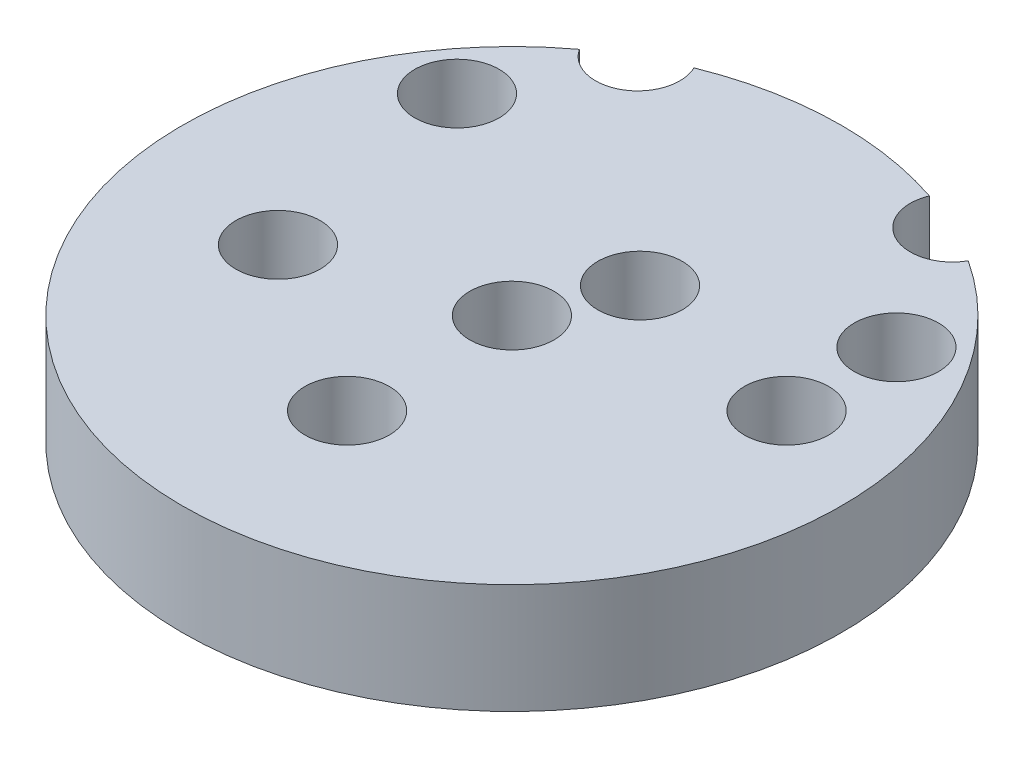
ISO-10303-21;
HEADER;
FILE_DESCRIPTION(('STEP AP214'),'2;1');
FILE_NAME('part.step','',(''),(''),'','','');
FILE_SCHEMA(('AUTOMOTIVE_DESIGN { 1 0 10303 214 1 1 1 1 }'));
ENDSEC;
DATA;
#1=APPLICATION_CONTEXT('core data for automotive mechanical design processes');
#2=APPLICATION_PROTOCOL_DEFINITION('international standard','automotive_design',2000,#1);
#3=PRODUCT_CONTEXT('',#1,'mechanical');
#4=PRODUCT('Part','Part','',(#3));
#5=PRODUCT_RELATED_PRODUCT_CATEGORY('part','',(#4));
#6=PRODUCT_DEFINITION_FORMATION('','',#4);
#7=PRODUCT_DEFINITION_CONTEXT('part definition',#1,'design');
#8=PRODUCT_DEFINITION('design','',#6,#7);
#9=PRODUCT_DEFINITION_SHAPE('','',#8);
#10=(LENGTH_UNIT() NAMED_UNIT(*) SI_UNIT(.MILLI.,.METRE.));
#11=(NAMED_UNIT(*) PLANE_ANGLE_UNIT() SI_UNIT($,.RADIAN.));
#12=(NAMED_UNIT(*) SI_UNIT($,.STERADIAN.) SOLID_ANGLE_UNIT());
#13=UNCERTAINTY_MEASURE_WITH_UNIT(LENGTH_MEASURE(1.E-05),#10,'distance_accuracy_value','');
#14=(GEOMETRIC_REPRESENTATION_CONTEXT(3) GLOBAL_UNCERTAINTY_ASSIGNED_CONTEXT((#13)) GLOBAL_UNIT_ASSIGNED_CONTEXT((#10,
#11,#12)) REPRESENTATION_CONTEXT('',''));
#15=CARTESIAN_POINT('',(0.,0.,0.));
#16=DIRECTION('',(0.,0.,1.));
#17=DIRECTION('',(1.,0.,0.));
#18=AXIS2_PLACEMENT_3D('',#15,#16,#17);
#19=CARTESIAN_POINT('',(0.,-25.4,0.));
#20=DIRECTION('',(0.,1.,0.));
#21=DIRECTION('',(0.,0.,1.));
#22=AXIS2_PLACEMENT_3D('',#19,#20,#21);
#23=CYLINDRICAL_SURFACE('',#22,76.2);
#24=DIRECTION('',(0.,1.,0.));
#25=VECTOR('',#24,1.);
#26=CARTESIAN_POINT('',(-45.5135836289187,-12.7,-61.1142676079279));
#27=LINE('',#26,#25);
#28=CARTESIAN_POINT('',(-45.5135836289187,-25.4,-61.1142676079279));
#29=VERTEX_POINT('',#28);
#30=CARTESIAN_POINT('',(-45.5135836289187,0.,-61.1142676079279));
#31=VERTEX_POINT('',#30);
#32=EDGE_CURVE('E11',#29,#31,#27,.T.);
#33=ORIENTED_EDGE('',*,*,#32,.F.);
#34=CARTESIAN_POINT('',(0.,-25.4,0.));
#35=DIRECTION('',(0.,1.,0.));
#36=DIRECTION('',(0.,0.,1.));
#37=AXIS2_PLACEMENT_3D('',#34,#35,#36);
#38=CIRCLE('',#37,76.2);
#39=CARTESIAN_POINT('',(41.7855591866639,-25.4,-63.7213233027831));
#40=VERTEX_POINT('',#39);
#41=EDGE_CURVE('E85',#29,#40,#38,.T.);
#42=ORIENTED_EDGE('',*,*,#41,.T.);
#43=DIRECTION('',(0.,1.,0.));
#44=VECTOR('',#43,1.);
#45=CARTESIAN_POINT('',(41.7855591866639,-12.7,-63.7213233027831));
#46=LINE('',#45,#44);
#47=CARTESIAN_POINT('',(41.7855591866639,0.,-63.7213233027831));
#48=VERTEX_POINT('',#47);
#49=EDGE_CURVE('E90',#48,#40,#46,.F.);
#50=ORIENTED_EDGE('',*,*,#49,.F.);
#51=CARTESIAN_POINT('',(0.,0.,0.));
#52=DIRECTION('',(0.,1.,0.));
#53=DIRECTION('',(0.,0.,1.));
#54=AXIS2_PLACEMENT_3D('',#51,#52,#53);
#55=CIRCLE('',#54,76.2);
#56=EDGE_CURVE('E98',#31,#48,#55,.T.);
#57=ORIENTED_EDGE('',*,*,#56,.F.);
#58=EDGE_LOOP('',(#33,#42,#50,#57));
#59=FACE_BOUND('',#58,.T.);
#60=ADVANCED_FACE('F33',(#59),#23,.T.);
#61=DIRECTION('',(0.,1.,0.));
#62=VECTOR('',#61,1.);
#63=CARTESIAN_POINT('',(-28.5497176341617,-12.7,-70.6495125461573));
#64=LINE('',#63,#62);
#65=CARTESIAN_POINT('',(-28.5497176341617,0.,-70.6495125461573));
#66=VERTEX_POINT('',#65);
#67=CARTESIAN_POINT('',(-28.5497176341617,-25.4,-70.6495125461573));
#68=VERTEX_POINT('',#67);
#69=EDGE_CURVE('E41',#66,#68,#64,.F.);
#70=ORIENTED_EDGE('',*,*,#69,.F.);
#71=CARTESIAN_POINT('',(24.2829202731572,0.,-72.2272786626181));
#72=VERTEX_POINT('',#71);
#73=EDGE_CURVE('E92',#72,#66,#55,.T.);
#74=ORIENTED_EDGE('',*,*,#73,.F.);
#75=DIRECTION('',(0.,1.,0.));
#76=VECTOR('',#75,1.);
#77=CARTESIAN_POINT('',(24.2829202731572,-12.7,-72.2272786626181));
#78=LINE('',#77,#76);
#79=CARTESIAN_POINT('',(24.2829202731572,-25.4,-72.2272786626181));
#80=VERTEX_POINT('',#79);
#81=EDGE_CURVE('E55',#80,#72,#78,.T.);
#82=ORIENTED_EDGE('',*,*,#81,.F.);
#83=EDGE_CURVE('E84',#80,#68,#38,.T.);
#84=ORIENTED_EDGE('',*,*,#83,.T.);
#85=EDGE_LOOP('',(#70,#74,#82,#84));
#86=FACE_BOUND('',#85,.T.);
#87=ADVANCED_FACE('F35',(#86),#23,.T.);
#88=CARTESIAN_POINT('',(0.,-25.4,0.));
#89=DIRECTION('',(0.,1.,0.));
#90=DIRECTION('',(0.,0.,1.));
#91=AXIS2_PLACEMENT_3D('',#88,#89,#90);
#92=PLANE('',#91);
#93=CARTESIAN_POINT('',(50.8,-25.4,-12.7));
#94=DIRECTION('',(0.,1.,0.));
#95=DIRECTION('',(0.,0.,1.));
#96=AXIS2_PLACEMENT_3D('',#93,#94,#95);
#97=CIRCLE('',#96,9.74999999999999);
#98=CARTESIAN_POINT('',(50.8,-25.4,-2.95));
#99=VERTEX_POINT('',#98);
#100=EDGE_CURVE('E173',#99,#99,#97,.T.);
#101=ORIENTED_EDGE('',*,*,#100,.T.);
#102=EDGE_LOOP('',(#101));
#103=FACE_BOUND('',#102,.T.);
#104=CARTESIAN_POINT('',(0.,-25.4,38.1));
#105=DIRECTION('',(0.,1.,0.));
#106=DIRECTION('',(0.,0.,1.));
#107=AXIS2_PLACEMENT_3D('',#104,#105,#106);
#108=CIRCLE('',#107,9.74999999999999);
#109=CARTESIAN_POINT('',(0.,-25.4,47.85));
#110=VERTEX_POINT('',#109);
#111=EDGE_CURVE('E183',#110,#110,#108,.T.);
#112=ORIENTED_EDGE('',*,*,#111,.T.);
#113=EDGE_LOOP('',(#112));
#114=FACE_BOUND('',#113,.T.);
#115=CARTESIAN_POINT('',(0.,-25.4,0.));
#116=DIRECTION('',(0.,1.,0.));
#117=DIRECTION('',(0.,0.,1.));
#118=AXIS2_PLACEMENT_3D('',#115,#116,#117);
#119=CIRCLE('',#118,9.74999999999999);
#120=CARTESIAN_POINT('',(0.,-25.4,9.74999999999999));
#121=VERTEX_POINT('',#120);
#122=EDGE_CURVE('E189',#121,#121,#119,.T.);
#123=ORIENTED_EDGE('',*,*,#122,.T.);
#124=EDGE_LOOP('',(#123));
#125=FACE_BOUND('',#124,.T.);
#126=CARTESIAN_POINT('',(-50.8,-25.4,-38.1));
#127=DIRECTION('',(0.,1.,0.));
#128=DIRECTION('',(0.,0.,1.));
#129=AXIS2_PLACEMENT_3D('',#126,#127,#128);
#130=CIRCLE('',#129,9.74999999999999);
#131=CARTESIAN_POINT('',(-50.8,-25.4,-28.35));
#132=VERTEX_POINT('',#131);
#133=EDGE_CURVE('E195',#132,#132,#130,.T.);
#134=ORIENTED_EDGE('',*,*,#133,.T.);
#135=EDGE_LOOP('',(#134));
#136=FACE_BOUND('',#135,.T.);
#137=CARTESIAN_POINT('',(50.8,-25.4,-38.1));
#138=DIRECTION('',(0.,1.,0.));
#139=DIRECTION('',(0.,0.,1.));
#140=AXIS2_PLACEMENT_3D('',#137,#138,#139);
#141=CIRCLE('',#140,9.74999999999999);
#142=CARTESIAN_POINT('',(50.8,-25.4,-28.35));
#143=VERTEX_POINT('',#142);
#144=EDGE_CURVE('E201',#143,#143,#141,.T.);
#145=ORIENTED_EDGE('',*,*,#144,.T.);
#146=EDGE_LOOP('',(#145));
#147=FACE_BOUND('',#146,.T.);
#148=CARTESIAN_POINT('',(8.79976324045967,-25.4,-20.8189520566973));
#149=DIRECTION('',(0.,1.,0.));
#150=DIRECTION('',(0.,0.,1.));
#151=AXIS2_PLACEMENT_3D('',#148,#149,#150);
#152=CIRCLE('',#151,9.74999999999999);
#153=CARTESIAN_POINT('',(8.79976324045967,-25.4,-11.0689520566974));
#154=VERTEX_POINT('',#153);
#155=EDGE_CURVE('E108',#154,#154,#152,.T.);
#156=ORIENTED_EDGE('',*,*,#155,.T.);
#157=EDGE_LOOP('',(#156));
#158=FACE_BOUND('',#157,.T.);
#159=CARTESIAN_POINT('',(-41.2086473699575,-25.4,12.8777023031116));
#160=DIRECTION('',(0.,1.,0.));
#161=DIRECTION('',(0.,0.,1.));
#162=AXIS2_PLACEMENT_3D('',#159,#160,#161);
#163=CIRCLE('',#162,9.74999999999999);
#164=CARTESIAN_POINT('',(-41.2086473699575,-25.4,22.6277023031116));
#165=VERTEX_POINT('',#164);
#166=EDGE_CURVE('E95',#165,#165,#163,.T.);
#167=ORIENTED_EDGE('',*,*,#166,.T.);
#168=EDGE_LOOP('',(#167));
#169=FACE_BOUND('',#168,.T.);
#170=ORIENTED_EDGE('',*,*,#41,.F.);
#171=CARTESIAN_POINT('',(-37.3372919814019,-25.4,-66.4256473622617));
#172=DIRECTION('',(0.,1.,0.));
#173=DIRECTION('',(0.,0.,1.));
#174=AXIS2_PLACEMENT_3D('',#171,#172,#173);
#175=CIRCLE('',#174,9.74999999999999);
#176=EDGE_CURVE('E73',#29,#68,#175,.T.);
#177=ORIENTED_EDGE('',*,*,#176,.T.);
#178=ORIENTED_EDGE('',*,*,#83,.F.);
#179=CARTESIAN_POINT('',(33.3068883818209,-25.4,-68.5353280164393));
#180=DIRECTION('',(0.,1.,0.));
#181=DIRECTION('',(0.,0.,1.));
#182=AXIS2_PLACEMENT_3D('',#179,#180,#181);
#183=CIRCLE('',#182,9.74999999999999);
#184=EDGE_CURVE('E86',#80,#40,#183,.T.);
#185=ORIENTED_EDGE('',*,*,#184,.T.);
#186=EDGE_LOOP('',(#170,#177,#178,#185));
#187=FACE_BOUND('',#186,.T.);
#188=ADVANCED_FACE('F82',(#103,#114,#125,#136,#147,#158,#169,#187),#92,.F.);
#189=CARTESIAN_POINT('',(0.,0.,0.));
#190=DIRECTION('',(0.,1.,0.));
#191=DIRECTION('',(0.,0.,1.));
#192=AXIS2_PLACEMENT_3D('',#189,#190,#191);
#193=PLANE('',#192);
#194=CARTESIAN_POINT('',(50.8,0.,-12.7));
#195=DIRECTION('',(0.,1.,0.));
#196=DIRECTION('',(0.,0.,1.));
#197=AXIS2_PLACEMENT_3D('',#194,#195,#196);
#198=CIRCLE('',#197,9.74999999999999);
#199=CARTESIAN_POINT('',(50.8,0.,-2.95));
#200=VERTEX_POINT('',#199);
#201=EDGE_CURVE('E176',#200,#200,#198,.T.);
#202=ORIENTED_EDGE('',*,*,#201,.F.);
#203=EDGE_LOOP('',(#202));
#204=FACE_BOUND('',#203,.T.);
#205=CARTESIAN_POINT('',(0.,0.,38.1));
#206=DIRECTION('',(0.,1.,0.));
#207=DIRECTION('',(0.,0.,1.));
#208=AXIS2_PLACEMENT_3D('',#205,#206,#207);
#209=CIRCLE('',#208,9.75);
#210=CARTESIAN_POINT('',(0.,0.,47.85));
#211=VERTEX_POINT('',#210);
#212=EDGE_CURVE('E178',#211,#211,#209,.T.);
#213=ORIENTED_EDGE('',*,*,#212,.F.);
#214=EDGE_LOOP('',(#213));
#215=FACE_BOUND('',#214,.T.);
#216=CARTESIAN_POINT('',(0.,0.,0.));
#217=DIRECTION('',(0.,1.,0.));
#218=DIRECTION('',(0.,0.,1.));
#219=AXIS2_PLACEMENT_3D('',#216,#217,#218);
#220=CIRCLE('',#219,9.75);
#221=CARTESIAN_POINT('',(0.,0.,9.75));
#222=VERTEX_POINT('',#221);
#223=EDGE_CURVE('E186',#222,#222,#220,.T.);
#224=ORIENTED_EDGE('',*,*,#223,.F.);
#225=EDGE_LOOP('',(#224));
#226=FACE_BOUND('',#225,.T.);
#227=CARTESIAN_POINT('',(-50.8,0.,-38.1));
#228=DIRECTION('',(0.,1.,0.));
#229=DIRECTION('',(0.,0.,1.));
#230=AXIS2_PLACEMENT_3D('',#227,#228,#229);
#231=CIRCLE('',#230,9.74999999999999);
#232=CARTESIAN_POINT('',(-50.8,0.,-28.35));
#233=VERTEX_POINT('',#232);
#234=EDGE_CURVE('E192',#233,#233,#231,.T.);
#235=ORIENTED_EDGE('',*,*,#234,.F.);
#236=EDGE_LOOP('',(#235));
#237=FACE_BOUND('',#236,.T.);
#238=CARTESIAN_POINT('',(50.8,0.,-38.1));
#239=DIRECTION('',(0.,1.,0.));
#240=DIRECTION('',(0.,0.,1.));
#241=AXIS2_PLACEMENT_3D('',#238,#239,#240);
#242=CIRCLE('',#241,9.74999999999999);
#243=CARTESIAN_POINT('',(50.8,0.,-28.35));
#244=VERTEX_POINT('',#243);
#245=EDGE_CURVE('E198',#244,#244,#242,.T.);
#246=ORIENTED_EDGE('',*,*,#245,.F.);
#247=EDGE_LOOP('',(#246));
#248=FACE_BOUND('',#247,.T.);
#249=CARTESIAN_POINT('',(-37.3372919814019,0.,-66.4256473622617));
#250=DIRECTION('',(0.,1.,0.));
#251=DIRECTION('',(0.,0.,1.));
#252=AXIS2_PLACEMENT_3D('',#249,#250,#251);
#253=CIRCLE('',#252,9.75);
#254=EDGE_CURVE('E47',#31,#66,#253,.T.);
#255=ORIENTED_EDGE('',*,*,#254,.F.);
#256=ORIENTED_EDGE('',*,*,#56,.T.);
#257=CARTESIAN_POINT('',(33.3068883818209,0.,-68.5353280164393));
#258=DIRECTION('',(0.,1.,0.));
#259=DIRECTION('',(0.,0.,1.));
#260=AXIS2_PLACEMENT_3D('',#257,#258,#259);
#261=CIRCLE('',#260,9.74999999999999);
#262=EDGE_CURVE('E88',#72,#48,#261,.T.);
#263=ORIENTED_EDGE('',*,*,#262,.F.);
#264=ORIENTED_EDGE('',*,*,#73,.T.);
#265=EDGE_LOOP('',(#255,#256,#263,#264));
#266=FACE_BOUND('',#265,.T.);
#267=CARTESIAN_POINT('',(8.79976324045967,0.,-20.8189520566973));
#268=DIRECTION('',(0.,1.,0.));
#269=DIRECTION('',(0.,0.,1.));
#270=AXIS2_PLACEMENT_3D('',#267,#268,#269);
#271=CIRCLE('',#270,9.75);
#272=CARTESIAN_POINT('',(8.79976324045967,0.,-11.0689520566974));
#273=VERTEX_POINT('',#272);
#274=EDGE_CURVE('E105',#273,#273,#271,.T.);
#275=ORIENTED_EDGE('',*,*,#274,.F.);
#276=EDGE_LOOP('',(#275));
#277=FACE_BOUND('',#276,.T.);
#278=CARTESIAN_POINT('',(-41.2086473699575,0.,12.8777023031116));
#279=DIRECTION('',(0.,1.,0.));
#280=DIRECTION('',(0.,0.,1.));
#281=AXIS2_PLACEMENT_3D('',#278,#279,#280);
#282=CIRCLE('',#281,9.74999999999999);
#283=CARTESIAN_POINT('',(-41.2086473699575,0.,22.6277023031116));
#284=VERTEX_POINT('',#283);
#285=EDGE_CURVE('E112',#284,#284,#282,.T.);
#286=ORIENTED_EDGE('',*,*,#285,.F.);
#287=EDGE_LOOP('',(#286));
#288=FACE_BOUND('',#287,.T.);
#289=ADVANCED_FACE('F120',(#204,#215,#226,#237,#248,#266,#277,#288),#193,.T.);
#290=CARTESIAN_POINT('',(-41.2086473699575,0.,12.8777023031116));
#291=DIRECTION('',(0.,1.,0.));
#292=DIRECTION('',(0.,0.,1.));
#293=AXIS2_PLACEMENT_3D('',#290,#291,#292);
#294=CYLINDRICAL_SURFACE('',#293,9.74999999999999);
#295=ORIENTED_EDGE('',*,*,#166,.F.);
#296=EDGE_LOOP('',(#295));
#297=FACE_BOUND('',#296,.T.);
#298=ORIENTED_EDGE('',*,*,#285,.T.);
#299=EDGE_LOOP('',(#298));
#300=FACE_BOUND('',#299,.T.);
#301=ADVANCED_FACE('F134',(#297,#300),#294,.F.);
#302=CARTESIAN_POINT('',(8.79976324045967,0.,-20.8189520566973));
#303=DIRECTION('',(0.,1.,0.));
#304=DIRECTION('',(0.,0.,1.));
#305=AXIS2_PLACEMENT_3D('',#302,#303,#304);
#306=CYLINDRICAL_SURFACE('',#305,9.75);
#307=ORIENTED_EDGE('',*,*,#155,.F.);
#308=EDGE_LOOP('',(#307));
#309=FACE_BOUND('',#308,.T.);
#310=ORIENTED_EDGE('',*,*,#274,.T.);
#311=EDGE_LOOP('',(#310));
#312=FACE_BOUND('',#311,.T.);
#313=ADVANCED_FACE('F141',(#309,#312),#306,.F.);
#314=CARTESIAN_POINT('',(33.3068883818209,0.,-68.5353280164393));
#315=DIRECTION('',(0.,1.,0.));
#316=DIRECTION('',(0.,0.,1.));
#317=AXIS2_PLACEMENT_3D('',#314,#315,#316);
#318=CYLINDRICAL_SURFACE('',#317,9.74999999999999);
#319=ORIENTED_EDGE('',*,*,#81,.T.);
#320=ORIENTED_EDGE('',*,*,#262,.T.);
#321=ORIENTED_EDGE('',*,*,#49,.T.);
#322=ORIENTED_EDGE('',*,*,#184,.F.);
#323=EDGE_LOOP('',(#319,#320,#321,#322));
#324=FACE_BOUND('',#323,.T.);
#325=ADVANCED_FACE('F102',(#324),#318,.F.);
#326=CARTESIAN_POINT('',(-37.3372919814019,0.,-66.4256473622617));
#327=DIRECTION('',(0.,1.,0.));
#328=DIRECTION('',(0.,0.,1.));
#329=AXIS2_PLACEMENT_3D('',#326,#327,#328);
#330=CYLINDRICAL_SURFACE('',#329,9.75);
#331=ORIENTED_EDGE('',*,*,#32,.T.);
#332=ORIENTED_EDGE('',*,*,#254,.T.);
#333=ORIENTED_EDGE('',*,*,#69,.T.);
#334=ORIENTED_EDGE('',*,*,#176,.F.);
#335=EDGE_LOOP('',(#331,#332,#333,#334));
#336=FACE_BOUND('',#335,.T.);
#337=ADVANCED_FACE('F72',(#336),#330,.F.);
#338=CARTESIAN_POINT('',(50.8,0.,-38.1));
#339=DIRECTION('',(0.,1.,0.));
#340=DIRECTION('',(0.,0.,1.));
#341=AXIS2_PLACEMENT_3D('',#338,#339,#340);
#342=CYLINDRICAL_SURFACE('',#341,9.74999999999999);
#343=ORIENTED_EDGE('',*,*,#144,.F.);
#344=EDGE_LOOP('',(#343));
#345=FACE_BOUND('',#344,.T.);
#346=ORIENTED_EDGE('',*,*,#245,.T.);
#347=EDGE_LOOP('',(#346));
#348=FACE_BOUND('',#347,.T.);
#349=ADVANCED_FACE('F150',(#345,#348),#342,.F.);
#350=CARTESIAN_POINT('',(-50.8,0.,-38.1));
#351=DIRECTION('',(0.,1.,0.));
#352=DIRECTION('',(0.,0.,1.));
#353=AXIS2_PLACEMENT_3D('',#350,#351,#352);
#354=CYLINDRICAL_SURFACE('',#353,9.74999999999999);
#355=ORIENTED_EDGE('',*,*,#133,.F.);
#356=EDGE_LOOP('',(#355));
#357=FACE_BOUND('',#356,.T.);
#358=ORIENTED_EDGE('',*,*,#234,.T.);
#359=EDGE_LOOP('',(#358));
#360=FACE_BOUND('',#359,.T.);
#361=ADVANCED_FACE('F153',(#357,#360),#354,.F.);
#362=CARTESIAN_POINT('',(0.,0.,0.));
#363=DIRECTION('',(0.,1.,0.));
#364=DIRECTION('',(0.,0.,1.));
#365=AXIS2_PLACEMENT_3D('',#362,#363,#364);
#366=CYLINDRICAL_SURFACE('',#365,9.75);
#367=ORIENTED_EDGE('',*,*,#122,.F.);
#368=EDGE_LOOP('',(#367));
#369=FACE_BOUND('',#368,.T.);
#370=ORIENTED_EDGE('',*,*,#223,.T.);
#371=EDGE_LOOP('',(#370));
#372=FACE_BOUND('',#371,.T.);
#373=ADVANCED_FACE('F157',(#369,#372),#366,.F.);
#374=CARTESIAN_POINT('',(0.,0.,38.1));
#375=DIRECTION('',(0.,1.,0.));
#376=DIRECTION('',(0.,0.,1.));
#377=AXIS2_PLACEMENT_3D('',#374,#375,#376);
#378=CYLINDRICAL_SURFACE('',#377,9.75);
#379=ORIENTED_EDGE('',*,*,#111,.F.);
#380=EDGE_LOOP('',(#379));
#381=FACE_BOUND('',#380,.T.);
#382=ORIENTED_EDGE('',*,*,#212,.T.);
#383=EDGE_LOOP('',(#382));
#384=FACE_BOUND('',#383,.T.);
#385=ADVANCED_FACE('F161',(#381,#384),#378,.F.);
#386=CARTESIAN_POINT('',(50.8,0.,-12.7));
#387=DIRECTION('',(0.,1.,0.));
#388=DIRECTION('',(0.,0.,1.));
#389=AXIS2_PLACEMENT_3D('',#386,#387,#388);
#390=CYLINDRICAL_SURFACE('',#389,9.74999999999999);
#391=ORIENTED_EDGE('',*,*,#100,.F.);
#392=EDGE_LOOP('',(#391));
#393=FACE_BOUND('',#392,.T.);
#394=ORIENTED_EDGE('',*,*,#201,.T.);
#395=EDGE_LOOP('',(#394));
#396=FACE_BOUND('',#395,.T.);
#397=ADVANCED_FACE('F165',(#393,#396),#390,.F.);
#398=CLOSED_SHELL('',(#60,#87,#188,#289,#301,#313,#325,#337,#349,#361,#373,#385,#397));
#399=MANIFOLD_SOLID_BREP('B2',#398);
#400=ADVANCED_BREP_SHAPE_REPRESENTATION('',(#18,#399),#14);
#401=SHAPE_DEFINITION_REPRESENTATION(#9,#400);
ENDSEC;
END-ISO-10303-21;
